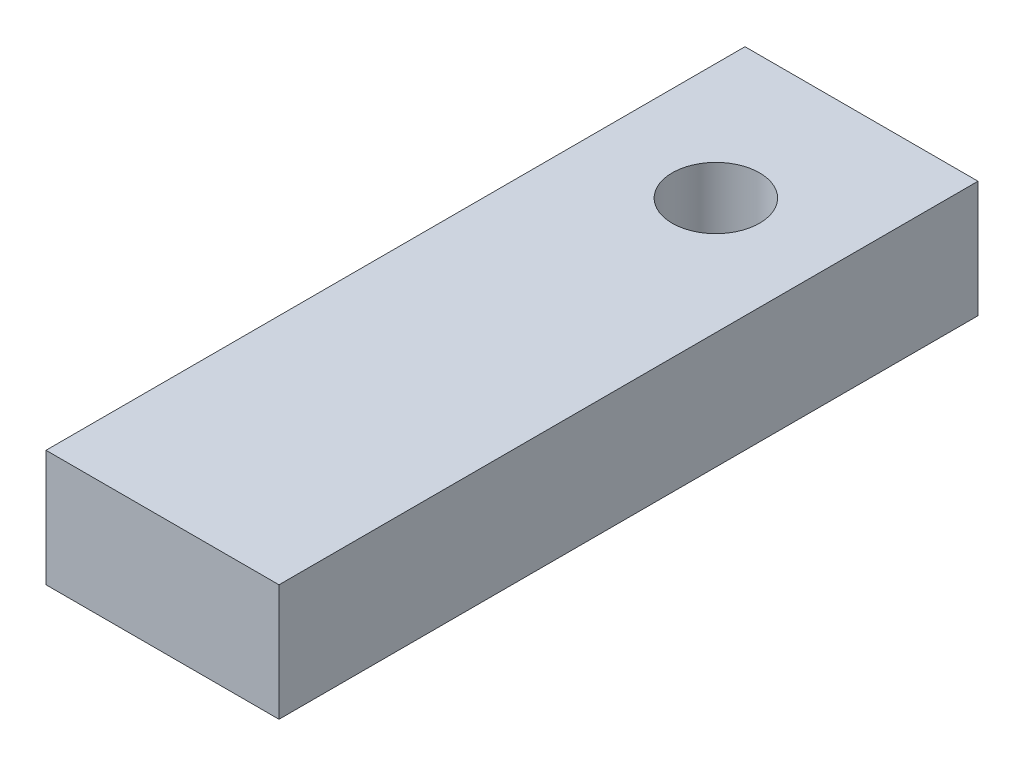
ISO-10303-21;
HEADER;
FILE_DESCRIPTION(('STEP AP214'),'2;1');
FILE_NAME('part.step','',(''),(''),'','','');
FILE_SCHEMA(('AUTOMOTIVE_DESIGN { 1 0 10303 214 1 1 1 1 }'));
ENDSEC;
DATA;
#1=APPLICATION_CONTEXT('core data for automotive mechanical design processes');
#2=APPLICATION_PROTOCOL_DEFINITION('international standard','automotive_design',2000,#1);
#3=PRODUCT_CONTEXT('',#1,'mechanical');
#4=PRODUCT('Part','Part','',(#3));
#5=PRODUCT_RELATED_PRODUCT_CATEGORY('part','',(#4));
#6=PRODUCT_DEFINITION_FORMATION('','',#4);
#7=PRODUCT_DEFINITION_CONTEXT('part definition',#1,'design');
#8=PRODUCT_DEFINITION('design','',#6,#7);
#9=PRODUCT_DEFINITION_SHAPE('','',#8);
#10=(LENGTH_UNIT() NAMED_UNIT(*) SI_UNIT(.MILLI.,.METRE.));
#11=(NAMED_UNIT(*) PLANE_ANGLE_UNIT() SI_UNIT($,.RADIAN.));
#12=(NAMED_UNIT(*) SI_UNIT($,.STERADIAN.) SOLID_ANGLE_UNIT());
#13=UNCERTAINTY_MEASURE_WITH_UNIT(LENGTH_MEASURE(1.E-05),#10,'distance_accuracy_value','');
#14=(GEOMETRIC_REPRESENTATION_CONTEXT(3) GLOBAL_UNCERTAINTY_ASSIGNED_CONTEXT((#13)) GLOBAL_UNIT_ASSIGNED_CONTEXT((#10,
#11,#12)) REPRESENTATION_CONTEXT('',''));
#15=CARTESIAN_POINT('',(0.,0.,0.));
#16=DIRECTION('',(0.,0.,1.));
#17=DIRECTION('',(1.,0.,0.));
#18=AXIS2_PLACEMENT_3D('',#15,#16,#17);
#19=CARTESIAN_POINT('',(50.8,-25.4,304.8));
#20=DIRECTION('',(-1.,0.,0.));
#21=DIRECTION('',(0.,0.,1.));
#22=AXIS2_PLACEMENT_3D('',#19,#20,#21);
#23=PLANE('',#22);
#24=DIRECTION('',(0.,1.,0.));
#25=VECTOR('',#24,1.);
#26=CARTESIAN_POINT('',(50.8,-25.4,0.));
#27=LINE('',#26,#25);
#28=CARTESIAN_POINT('',(50.8,-25.4,0.));
#29=VERTEX_POINT('',#28);
#30=CARTESIAN_POINT('',(50.8,25.4,0.));
#31=VERTEX_POINT('',#30);
#32=EDGE_CURVE('E106',#29,#31,#27,.T.);
#33=ORIENTED_EDGE('',*,*,#32,.T.);
#34=DIRECTION('',(0.,0.,-1.));
#35=VECTOR('',#34,1.);
#36=CARTESIAN_POINT('',(50.8,25.4,304.8));
#37=LINE('',#36,#35);
#38=CARTESIAN_POINT('',(50.8,25.4,304.8));
#39=VERTEX_POINT('',#38);
#40=EDGE_CURVE('E11',#39,#31,#37,.T.);
#41=ORIENTED_EDGE('',*,*,#40,.F.);
#42=DIRECTION('',(0.,1.,0.));
#43=VECTOR('',#42,1.);
#44=CARTESIAN_POINT('',(50.8,-25.4,304.8));
#45=LINE('',#44,#43);
#46=CARTESIAN_POINT('',(50.8,-25.4,304.8));
#47=VERTEX_POINT('',#46);
#48=EDGE_CURVE('E94',#47,#39,#45,.T.);
#49=ORIENTED_EDGE('',*,*,#48,.F.);
#50=DIRECTION('',(0.,0.,-1.));
#51=VECTOR('',#50,1.);
#52=CARTESIAN_POINT('',(50.8,-25.4,304.8));
#53=LINE('',#52,#51);
#54=EDGE_CURVE('E102',#47,#29,#53,.T.);
#55=ORIENTED_EDGE('',*,*,#54,.T.);
#56=EDGE_LOOP('',(#33,#41,#49,#55));
#57=FACE_BOUND('',#56,.T.);
#58=ADVANCED_FACE('F43',(#57),#23,.F.);
#59=CARTESIAN_POINT('',(-50.8,25.4,304.8));
#60=DIRECTION('',(0.,-1.,0.));
#61=DIRECTION('',(0.,0.,-1.));
#62=AXIS2_PLACEMENT_3D('',#59,#60,#61);
#63=PLANE('',#62);
#64=CARTESIAN_POINT('',(0.,25.4,63.5));
#65=DIRECTION('',(0.,1.,0.));
#66=DIRECTION('',(0.,0.,1.));
#67=AXIS2_PLACEMENT_3D('',#64,#65,#66);
#68=CIRCLE('',#67,19.05);
#69=CARTESIAN_POINT('',(0.,25.4,82.55));
#70=VERTEX_POINT('',#69);
#71=EDGE_CURVE('E120',#70,#70,#68,.T.);
#72=ORIENTED_EDGE('',*,*,#71,.F.);
#73=EDGE_LOOP('',(#72));
#74=FACE_BOUND('',#73,.T.);
#75=DIRECTION('',(-1.,0.,0.));
#76=VECTOR('',#75,1.);
#77=CARTESIAN_POINT('',(-50.8,25.4,0.));
#78=LINE('',#77,#76);
#79=CARTESIAN_POINT('',(-50.8,25.4,0.));
#80=VERTEX_POINT('',#79);
#81=EDGE_CURVE('E98',#31,#80,#78,.T.);
#82=ORIENTED_EDGE('',*,*,#81,.T.);
#83=DIRECTION('',(0.,0.,-1.));
#84=VECTOR('',#83,1.);
#85=CARTESIAN_POINT('',(-50.8,25.4,304.8));
#86=LINE('',#85,#84);
#87=CARTESIAN_POINT('',(-50.8,25.4,304.8));
#88=VERTEX_POINT('',#87);
#89=EDGE_CURVE('E51',#88,#80,#86,.T.);
#90=ORIENTED_EDGE('',*,*,#89,.F.);
#91=DIRECTION('',(-1.,0.,0.));
#92=VECTOR('',#91,1.);
#93=CARTESIAN_POINT('',(-50.8,25.4,304.8));
#94=LINE('',#93,#92);
#95=EDGE_CURVE('E89',#39,#88,#94,.T.);
#96=ORIENTED_EDGE('',*,*,#95,.F.);
#97=ORIENTED_EDGE('',*,*,#40,.T.);
#98=EDGE_LOOP('',(#82,#90,#96,#97));
#99=FACE_BOUND('',#98,.T.);
#100=ADVANCED_FACE('F97',(#74,#99),#63,.F.);
#101=CARTESIAN_POINT('',(-50.8,-25.4,304.8));
#102=DIRECTION('',(1.,0.,0.));
#103=DIRECTION('',(0.,0.,-1.));
#104=AXIS2_PLACEMENT_3D('',#101,#102,#103);
#105=PLANE('',#104);
#106=DIRECTION('',(0.,-1.,0.));
#107=VECTOR('',#106,1.);
#108=CARTESIAN_POINT('',(-50.8,-25.4,0.));
#109=LINE('',#108,#107);
#110=CARTESIAN_POINT('',(-50.8,-25.4,0.));
#111=VERTEX_POINT('',#110);
#112=EDGE_CURVE('E76',#80,#111,#109,.T.);
#113=ORIENTED_EDGE('',*,*,#112,.T.);
#114=DIRECTION('',(0.,0.,-1.));
#115=VECTOR('',#114,1.);
#116=CARTESIAN_POINT('',(-50.8,-25.4,304.8));
#117=LINE('',#116,#115);
#118=CARTESIAN_POINT('',(-50.8,-25.4,304.8));
#119=VERTEX_POINT('',#118);
#120=EDGE_CURVE('E99',#119,#111,#117,.T.);
#121=ORIENTED_EDGE('',*,*,#120,.F.);
#122=DIRECTION('',(0.,-1.,0.));
#123=VECTOR('',#122,1.);
#124=CARTESIAN_POINT('',(-50.8,-25.4,304.8));
#125=LINE('',#124,#123);
#126=EDGE_CURVE('E92',#88,#119,#125,.T.);
#127=ORIENTED_EDGE('',*,*,#126,.F.);
#128=ORIENTED_EDGE('',*,*,#89,.T.);
#129=EDGE_LOOP('',(#113,#121,#127,#128));
#130=FACE_BOUND('',#129,.T.);
#131=ADVANCED_FACE('F100',(#130),#105,.F.);
#132=CARTESIAN_POINT('',(-50.8,-25.4,304.8));
#133=DIRECTION('',(0.,1.,0.));
#134=DIRECTION('',(0.,0.,1.));
#135=AXIS2_PLACEMENT_3D('',#132,#133,#134);
#136=PLANE('',#135);
#137=CARTESIAN_POINT('',(0.,-25.4,63.5));
#138=DIRECTION('',(0.,1.,0.));
#139=DIRECTION('',(0.,0.,1.));
#140=AXIS2_PLACEMENT_3D('',#137,#138,#139);
#141=CIRCLE('',#140,19.05);
#142=CARTESIAN_POINT('',(0.,-25.4,82.55));
#143=VERTEX_POINT('',#142);
#144=EDGE_CURVE('E109',#143,#143,#141,.T.);
#145=ORIENTED_EDGE('',*,*,#144,.T.);
#146=EDGE_LOOP('',(#145));
#147=FACE_BOUND('',#146,.T.);
#148=DIRECTION('',(1.,0.,0.));
#149=VECTOR('',#148,1.);
#150=CARTESIAN_POINT('',(-50.8,-25.4,0.));
#151=LINE('',#150,#149);
#152=EDGE_CURVE('E82',#111,#29,#151,.T.);
#153=ORIENTED_EDGE('',*,*,#152,.T.);
#154=ORIENTED_EDGE('',*,*,#54,.F.);
#155=DIRECTION('',(1.,0.,0.));
#156=VECTOR('',#155,1.);
#157=CARTESIAN_POINT('',(-50.8,-25.4,304.8));
#158=LINE('',#157,#156);
#159=EDGE_CURVE('E59',#119,#47,#158,.T.);
#160=ORIENTED_EDGE('',*,*,#159,.F.);
#161=ORIENTED_EDGE('',*,*,#120,.T.);
#162=EDGE_LOOP('',(#153,#154,#160,#161));
#163=FACE_BOUND('',#162,.T.);
#164=ADVANCED_FACE('F114',(#147,#163),#136,.F.);
#165=CARTESIAN_POINT('',(0.,0.,304.8));
#166=DIRECTION('',(0.,0.,-1.));
#167=DIRECTION('',(-1.,0.,0.));
#168=AXIS2_PLACEMENT_3D('',#165,#166,#167);
#169=PLANE('',#168);
#170=ORIENTED_EDGE('',*,*,#48,.T.);
#171=ORIENTED_EDGE('',*,*,#95,.T.);
#172=ORIENTED_EDGE('',*,*,#126,.T.);
#173=ORIENTED_EDGE('',*,*,#159,.T.);
#174=EDGE_LOOP('',(#170,#171,#172,#173));
#175=FACE_BOUND('',#174,.T.);
#176=ADVANCED_FACE('F90',(#175),#169,.F.);
#177=CARTESIAN_POINT('',(0.,0.,0.));
#178=DIRECTION('',(0.,0.,-1.));
#179=DIRECTION('',(-1.,0.,0.));
#180=AXIS2_PLACEMENT_3D('',#177,#178,#179);
#181=PLANE('',#180);
#182=ORIENTED_EDGE('',*,*,#32,.F.);
#183=ORIENTED_EDGE('',*,*,#152,.F.);
#184=ORIENTED_EDGE('',*,*,#112,.F.);
#185=ORIENTED_EDGE('',*,*,#81,.F.);
#186=EDGE_LOOP('',(#182,#183,#184,#185));
#187=FACE_BOUND('',#186,.T.);
#188=ADVANCED_FACE('F117',(#187),#181,.T.);
#189=CARTESIAN_POINT('',(0.,-25.4,63.5));
#190=DIRECTION('',(0.,1.,0.));
#191=DIRECTION('',(0.,0.,1.));
#192=AXIS2_PLACEMENT_3D('',#189,#190,#191);
#193=CYLINDRICAL_SURFACE('',#192,19.05);
#194=ORIENTED_EDGE('',*,*,#144,.F.);
#195=EDGE_LOOP('',(#194));
#196=FACE_BOUND('',#195,.T.);
#197=ORIENTED_EDGE('',*,*,#71,.T.);
#198=EDGE_LOOP('',(#197));
#199=FACE_BOUND('',#198,.T.);
#200=ADVANCED_FACE('F127',(#196,#199),#193,.F.);
#201=CLOSED_SHELL('',(#58,#100,#131,#164,#176,#188,#200));
#202=MANIFOLD_SOLID_BREP('B2',#201);
#203=ADVANCED_BREP_SHAPE_REPRESENTATION('',(#18,#202),#14);
#204=SHAPE_DEFINITION_REPRESENTATION(#9,#203);
ENDSEC;
END-ISO-10303-21;
